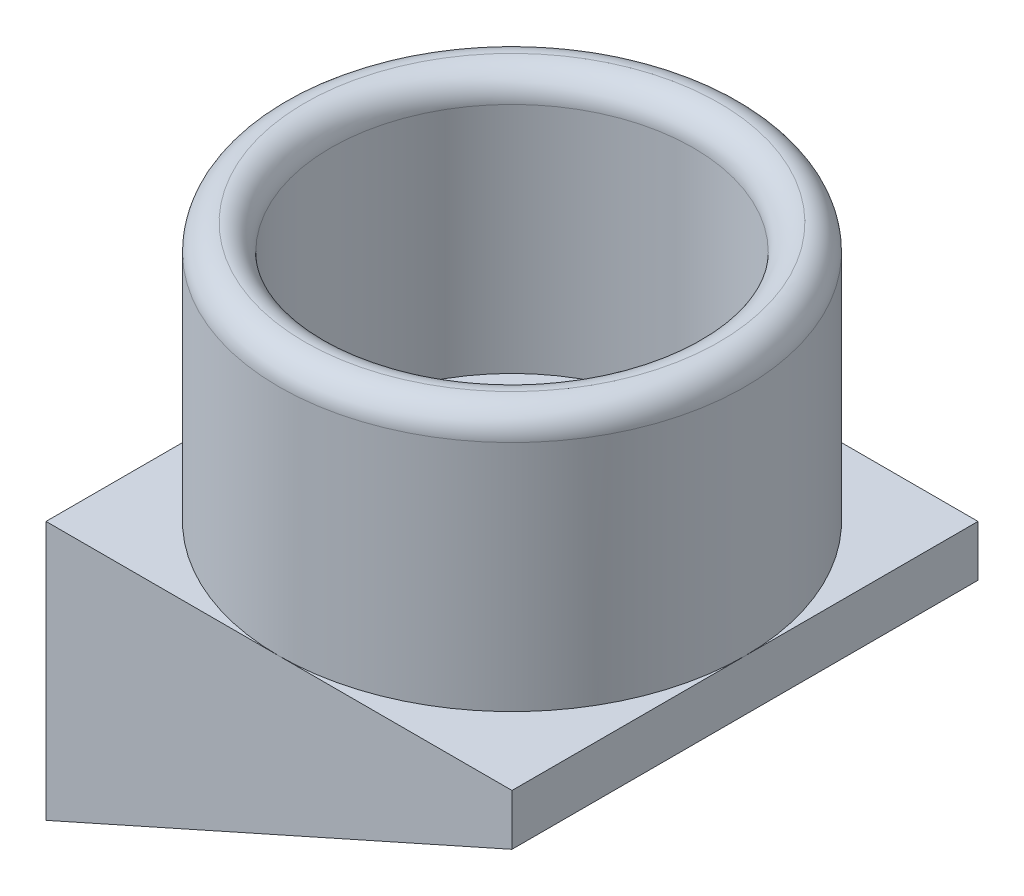
ISO-10303-21;
HEADER;
FILE_DESCRIPTION(('STEP AP214'),'2;1');
FILE_NAME('part.step','',(''),(''),'','','');
FILE_SCHEMA(('AUTOMOTIVE_DESIGN { 1 0 10303 214 1 1 1 1 }'));
ENDSEC;
DATA;
#1=APPLICATION_CONTEXT('core data for automotive mechanical design processes');
#2=APPLICATION_PROTOCOL_DEFINITION('international standard','automotive_design',2000,#1);
#3=PRODUCT_CONTEXT('',#1,'mechanical');
#4=PRODUCT('Part','Part','',(#3));
#5=PRODUCT_RELATED_PRODUCT_CATEGORY('part','',(#4));
#6=PRODUCT_DEFINITION_FORMATION('','',#4);
#7=PRODUCT_DEFINITION_CONTEXT('part definition',#1,'design');
#8=PRODUCT_DEFINITION('design','',#6,#7);
#9=PRODUCT_DEFINITION_SHAPE('','',#8);
#10=(LENGTH_UNIT() NAMED_UNIT(*) SI_UNIT(.MILLI.,.METRE.));
#11=(NAMED_UNIT(*) PLANE_ANGLE_UNIT() SI_UNIT($,.RADIAN.));
#12=(NAMED_UNIT(*) SI_UNIT($,.STERADIAN.) SOLID_ANGLE_UNIT());
#13=UNCERTAINTY_MEASURE_WITH_UNIT(LENGTH_MEASURE(1.E-05),#10,'distance_accuracy_value','');
#14=(GEOMETRIC_REPRESENTATION_CONTEXT(3) GLOBAL_UNCERTAINTY_ASSIGNED_CONTEXT((#13)) GLOBAL_UNIT_ASSIGNED_CONTEXT((#10,
#11,#12)) REPRESENTATION_CONTEXT('',''));
#15=CARTESIAN_POINT('',(0.,0.,0.));
#16=DIRECTION('',(0.,0.,1.));
#17=DIRECTION('',(1.,0.,0.));
#18=AXIS2_PLACEMENT_3D('',#15,#16,#17);
#19=CARTESIAN_POINT('',(0.,10.,0.));
#20=DIRECTION('',(0.,-1.,0.));
#21=DIRECTION('',(0.,0.,-1.));
#22=AXIS2_PLACEMENT_3D('',#19,#20,#21);
#23=CYLINDRICAL_SURFACE('',#22,9.);
#24=CARTESIAN_POINT('',(0.,9.,0.));
#25=DIRECTION('',(0.,1.,0.));
#26=DIRECTION('',(0.,0.,1.));
#27=AXIS2_PLACEMENT_3D('',#24,#25,#26);
#28=CIRCLE('',#27,9.);
#29=CARTESIAN_POINT('',(0.,9.,9.));
#30=VERTEX_POINT('',#29);
#31=EDGE_CURVE('E11',#30,#30,#28,.F.);
#32=ORIENTED_EDGE('',*,*,#31,.T.);
#33=EDGE_LOOP('',(#32));
#34=FACE_BOUND('',#33,.T.);
#35=CARTESIAN_POINT('',(0.,0.,0.));
#36=DIRECTION('',(0.,1.,0.));
#37=DIRECTION('',(0.,0.,1.));
#38=AXIS2_PLACEMENT_3D('',#35,#36,#37);
#39=CIRCLE('',#38,9.);
#40=CARTESIAN_POINT('',(0.,0.,9.));
#41=VERTEX_POINT('',#40);
#42=CARTESIAN_POINT('',(9.,0.,0.));
#43=VERTEX_POINT('',#42);
#44=EDGE_CURVE('E145',#41,#43,#39,.T.);
#45=ORIENTED_EDGE('',*,*,#44,.T.);
#46=CARTESIAN_POINT('',(0.,0.,-9.));
#47=VERTEX_POINT('',#46);
#48=EDGE_CURVE('E149',#43,#47,#39,.T.);
#49=ORIENTED_EDGE('',*,*,#48,.T.);
#50=CARTESIAN_POINT('',(-9.,0.,0.));
#51=VERTEX_POINT('',#50);
#52=EDGE_CURVE('E288',#47,#51,#39,.T.);
#53=ORIENTED_EDGE('',*,*,#52,.T.);
#54=EDGE_CURVE('E69',#51,#41,#39,.T.);
#55=ORIENTED_EDGE('',*,*,#54,.T.);
#56=EDGE_LOOP('',(#45,#49,#53,#55));
#57=FACE_BOUND('',#56,.T.);
#58=ADVANCED_FACE('F45',(#34,#57),#23,.T.);
#59=CARTESIAN_POINT('',(0.,10.,0.));
#60=DIRECTION('',(0.,-1.,0.));
#61=DIRECTION('',(0.,0.,-1.));
#62=AXIS2_PLACEMENT_3D('',#59,#60,#61);
#63=CYLINDRICAL_SURFACE('',#62,7.);
#64=CARTESIAN_POINT('',(0.,9.,0.));
#65=DIRECTION('',(0.,1.,0.));
#66=DIRECTION('',(0.,0.,1.));
#67=AXIS2_PLACEMENT_3D('',#64,#65,#66);
#68=CIRCLE('',#67,7.);
#69=CARTESIAN_POINT('',(0.,9.,7.));
#70=VERTEX_POINT('',#69);
#71=EDGE_CURVE('E55',#70,#70,#68,.T.);
#72=ORIENTED_EDGE('',*,*,#71,.T.);
#73=EDGE_LOOP('',(#72));
#74=FACE_BOUND('',#73,.T.);
#75=CARTESIAN_POINT('',(0.,0.,0.));
#76=DIRECTION('',(0.,1.,0.));
#77=DIRECTION('',(0.,0.,1.));
#78=AXIS2_PLACEMENT_3D('',#75,#76,#77);
#79=CIRCLE('',#78,7.);
#80=CARTESIAN_POINT('',(0.,0.,7.));
#81=VERTEX_POINT('',#80);
#82=EDGE_CURVE('E141',#81,#81,#79,.T.);
#83=ORIENTED_EDGE('',*,*,#82,.F.);
#84=EDGE_LOOP('',(#83));
#85=FACE_BOUND('',#84,.T.);
#86=ADVANCED_FACE('F154',(#74,#85),#63,.F.);
#87=CARTESIAN_POINT('',(0.,9.,0.));
#88=DIRECTION('',(0.,1.,0.));
#89=DIRECTION('',(0.,0.,1.));
#90=AXIS2_PLACEMENT_3D('',#87,#88,#89);
#91=TOROIDAL_SURFACE('',#90,8.,1.);
#92=ORIENTED_EDGE('',*,*,#31,.F.);
#93=EDGE_LOOP('',(#92));
#94=FACE_BOUND('',#93,.T.);
#95=CARTESIAN_POINT('',(0.,10.,0.));
#96=DIRECTION('',(0.,1.,0.));
#97=DIRECTION('',(0.,0.,1.));
#98=AXIS2_PLACEMENT_3D('',#95,#96,#97);
#99=CIRCLE('',#98,8.);
#100=CARTESIAN_POINT('',(0.,10.,8.));
#101=VERTEX_POINT('',#100);
#102=EDGE_CURVE('E49',#101,#101,#99,.T.);
#103=ORIENTED_EDGE('',*,*,#102,.F.);
#104=EDGE_LOOP('',(#103));
#105=FACE_BOUND('',#104,.T.);
#106=ADVANCED_FACE('F47',(#94,#105),#91,.T.);
#107=CARTESIAN_POINT('',(0.,9.,0.));
#108=DIRECTION('',(0.,1.,0.));
#109=DIRECTION('',(0.,0.,1.));
#110=AXIS2_PLACEMENT_3D('',#107,#108,#109);
#111=TOROIDAL_SURFACE('',#110,8.,1.);
#112=ORIENTED_EDGE('',*,*,#102,.T.);
#113=EDGE_LOOP('',(#112));
#114=FACE_BOUND('',#113,.T.);
#115=ORIENTED_EDGE('',*,*,#71,.F.);
#116=EDGE_LOOP('',(#115));
#117=FACE_BOUND('',#116,.T.);
#118=ADVANCED_FACE('F157',(#114,#117),#111,.T.);
#119=CARTESIAN_POINT('',(0.,0.,0.));
#120=DIRECTION('',(0.,1.,0.));
#121=DIRECTION('',(0.,0.,1.));
#122=AXIS2_PLACEMENT_3D('',#119,#120,#121);
#123=PLANE('',#122);
#124=ORIENTED_EDGE('',*,*,#82,.T.);
#125=EDGE_LOOP('',(#124));
#126=FACE_BOUND('',#125,.T.);
#127=ADVANCED_FACE('F159',(#126),#123,.T.);
#128=ORIENTED_EDGE('',*,*,#44,.F.);
#129=DIRECTION('',(-1.,0.,0.));
#130=VECTOR('',#129,1.);
#131=CARTESIAN_POINT('',(-9.,0.,9.));
#132=LINE('',#131,#130);
#133=CARTESIAN_POINT('',(9.,0.,9.));
#134=VERTEX_POINT('',#133);
#135=EDGE_CURVE('E62',#134,#41,#132,.T.);
#136=ORIENTED_EDGE('',*,*,#135,.F.);
#137=DIRECTION('',(0.,0.,1.));
#138=VECTOR('',#137,1.);
#139=CARTESIAN_POINT('',(9.,0.,-9.));
#140=LINE('',#139,#138);
#141=EDGE_CURVE('E284',#43,#134,#140,.T.);
#142=ORIENTED_EDGE('',*,*,#141,.F.);
#143=EDGE_LOOP('',(#128,#136,#142));
#144=FACE_BOUND('',#143,.T.);
#145=ADVANCED_FACE('F166',(#144),#123,.T.);
#146=ORIENTED_EDGE('',*,*,#48,.F.);
#147=CARTESIAN_POINT('',(9.,0.,-9.));
#148=VERTEX_POINT('',#147);
#149=EDGE_CURVE('E294',#148,#43,#140,.T.);
#150=ORIENTED_EDGE('',*,*,#149,.F.);
#151=DIRECTION('',(1.,0.,0.));
#152=VECTOR('',#151,1.);
#153=CARTESIAN_POINT('',(-9.,0.,-9.));
#154=LINE('',#153,#152);
#155=EDGE_CURVE('E295',#47,#148,#154,.T.);
#156=ORIENTED_EDGE('',*,*,#155,.F.);
#157=EDGE_LOOP('',(#146,#150,#156));
#158=FACE_BOUND('',#157,.T.);
#159=ADVANCED_FACE('F228',(#158),#123,.T.);
#160=ORIENTED_EDGE('',*,*,#52,.F.);
#161=CARTESIAN_POINT('',(-9.,0.,-9.));
#162=VERTEX_POINT('',#161);
#163=EDGE_CURVE('E113',#162,#47,#154,.T.);
#164=ORIENTED_EDGE('',*,*,#163,.F.);
#165=DIRECTION('',(0.,0.,-1.));
#166=VECTOR('',#165,1.);
#167=CARTESIAN_POINT('',(-9.,0.,-9.));
#168=LINE('',#167,#166);
#169=EDGE_CURVE('E128',#51,#162,#168,.T.);
#170=ORIENTED_EDGE('',*,*,#169,.F.);
#171=EDGE_LOOP('',(#160,#164,#170));
#172=FACE_BOUND('',#171,.T.);
#173=ADVANCED_FACE('F221',(#172),#123,.T.);
#174=ORIENTED_EDGE('',*,*,#54,.F.);
#175=CARTESIAN_POINT('',(-9.,0.,9.));
#176=VERTEX_POINT('',#175);
#177=EDGE_CURVE('E297',#176,#51,#168,.T.);
#178=ORIENTED_EDGE('',*,*,#177,.F.);
#179=EDGE_CURVE('E304',#41,#176,#132,.T.);
#180=ORIENTED_EDGE('',*,*,#179,.F.);
#181=EDGE_LOOP('',(#174,#178,#180));
#182=FACE_BOUND('',#181,.T.);
#183=ADVANCED_FACE('F169',(#182),#123,.T.);
#184=CARTESIAN_POINT('',(9.,-10.,-9.));
#185=DIRECTION('',(-1.,0.,0.));
#186=DIRECTION('',(0.,0.,1.));
#187=AXIS2_PLACEMENT_3D('',#184,#185,#186);
#188=PLANE('',#187);
#189=DIRECTION('',(0.,1.,0.));
#190=VECTOR('',#189,1.);
#191=CARTESIAN_POINT('',(9.,-10.,9.));
#192=LINE('',#191,#190);
#193=CARTESIAN_POINT('',(9.,-1.9697719153613,9.));
#194=VERTEX_POINT('',#193);
#195=EDGE_CURVE('E134',#194,#134,#192,.T.);
#196=ORIENTED_EDGE('',*,*,#195,.F.);
#197=DIRECTION('',(0.,0.,1.));
#198=VECTOR('',#197,1.);
#199=CARTESIAN_POINT('',(9.,-1.9697719153613,-9.));
#200=LINE('',#199,#198);
#201=CARTESIAN_POINT('',(9.,-1.9697719153613,-9.));
#202=VERTEX_POINT('',#201);
#203=EDGE_CURVE('E124',#202,#194,#200,.T.);
#204=ORIENTED_EDGE('',*,*,#203,.F.);
#205=DIRECTION('',(0.,1.,0.));
#206=VECTOR('',#205,1.);
#207=CARTESIAN_POINT('',(9.,-10.,-9.));
#208=LINE('',#207,#206);
#209=EDGE_CURVE('E112',#202,#148,#208,.T.);
#210=ORIENTED_EDGE('',*,*,#209,.T.);
#211=ORIENTED_EDGE('',*,*,#149,.T.);
#212=ORIENTED_EDGE('',*,*,#141,.T.);
#213=EDGE_LOOP('',(#196,#204,#210,#211,#212));
#214=FACE_BOUND('',#213,.T.);
#215=ADVANCED_FACE('F180',(#214),#188,.F.);
#216=CARTESIAN_POINT('',(-9.,-10.,9.));
#217=DIRECTION('',(0.,0.,-1.));
#218=DIRECTION('',(-1.,0.,0.));
#219=AXIS2_PLACEMENT_3D('',#216,#217,#218);
#220=PLANE('',#219);
#221=DIRECTION('',(0.,1.,0.));
#222=VECTOR('',#221,1.);
#223=CARTESIAN_POINT('',(-9.,-10.,9.));
#224=LINE('',#223,#222);
#225=CARTESIAN_POINT('',(-9.,-10.,9.));
#226=VERTEX_POINT('',#225);
#227=EDGE_CURVE('E130',#226,#176,#224,.T.);
#228=ORIENTED_EDGE('',*,*,#227,.F.);
#229=DIRECTION('',(-0.913241464819191,-0.407418736602648,0.));
#230=VECTOR('',#229,1.);
#231=CARTESIAN_POINT('',(9.,-1.9697719153613,9.));
#232=LINE('',#231,#230);
#233=EDGE_CURVE('E106',#194,#226,#232,.T.);
#234=ORIENTED_EDGE('',*,*,#233,.F.);
#235=ORIENTED_EDGE('',*,*,#195,.T.);
#236=ORIENTED_EDGE('',*,*,#135,.T.);
#237=ORIENTED_EDGE('',*,*,#179,.T.);
#238=EDGE_LOOP('',(#228,#234,#235,#236,#237));
#239=FACE_BOUND('',#238,.T.);
#240=ADVANCED_FACE('F183',(#239),#220,.F.);
#241=CARTESIAN_POINT('',(-9.,-10.,-9.));
#242=DIRECTION('',(1.,0.,0.));
#243=DIRECTION('',(0.,0.,-1.));
#244=AXIS2_PLACEMENT_3D('',#241,#242,#243);
#245=PLANE('',#244);
#246=ORIENTED_EDGE('',*,*,#177,.T.);
#247=ORIENTED_EDGE('',*,*,#169,.T.);
#248=DIRECTION('',(0.,1.,0.));
#249=VECTOR('',#248,1.);
#250=CARTESIAN_POINT('',(-9.,-10.,-9.));
#251=LINE('',#250,#249);
#252=CARTESIAN_POINT('',(-9.,-10.,-9.));
#253=VERTEX_POINT('',#252);
#254=EDGE_CURVE('E120',#253,#162,#251,.T.);
#255=ORIENTED_EDGE('',*,*,#254,.F.);
#256=DIRECTION('',(0.,0.,-1.));
#257=VECTOR('',#256,1.);
#258=CARTESIAN_POINT('',(-9.,-10.,-9.));
#259=LINE('',#258,#257);
#260=EDGE_CURVE('E100',#226,#253,#259,.T.);
#261=ORIENTED_EDGE('',*,*,#260,.F.);
#262=ORIENTED_EDGE('',*,*,#227,.T.);
#263=EDGE_LOOP('',(#246,#247,#255,#261,#262));
#264=FACE_BOUND('',#263,.T.);
#265=ADVANCED_FACE('F127',(#264),#245,.F.);
#266=CARTESIAN_POINT('',(-9.,-10.,-9.));
#267=DIRECTION('',(0.,0.,1.));
#268=DIRECTION('',(1.,0.,0.));
#269=AXIS2_PLACEMENT_3D('',#266,#267,#268);
#270=PLANE('',#269);
#271=ORIENTED_EDGE('',*,*,#209,.F.);
#272=DIRECTION('',(-0.913241464819191,-0.407418736602648,0.));
#273=VECTOR('',#272,1.);
#274=CARTESIAN_POINT('',(9.,-1.9697719153613,-9.));
#275=LINE('',#274,#273);
#276=EDGE_CURVE('E103',#202,#253,#275,.T.);
#277=ORIENTED_EDGE('',*,*,#276,.T.);
#278=ORIENTED_EDGE('',*,*,#254,.T.);
#279=ORIENTED_EDGE('',*,*,#163,.T.);
#280=ORIENTED_EDGE('',*,*,#155,.T.);
#281=EDGE_LOOP('',(#271,#277,#278,#279,#280));
#282=FACE_BOUND('',#281,.T.);
#283=ADVANCED_FACE('F118',(#282),#270,.F.);
#284=CARTESIAN_POINT('',(9.,-1.9697719153613,-9.));
#285=DIRECTION('',(-0.407418736602648,0.913241464819192,0.));
#286=DIRECTION('',(-0.913241464819192,-0.407418736602648,0.));
#287=AXIS2_PLACEMENT_3D('',#284,#285,#286);
#288=PLANE('',#287);
#289=ORIENTED_EDGE('',*,*,#233,.T.);
#290=ORIENTED_EDGE('',*,*,#260,.T.);
#291=ORIENTED_EDGE('',*,*,#276,.F.);
#292=ORIENTED_EDGE('',*,*,#203,.T.);
#293=EDGE_LOOP('',(#289,#290,#291,#292));
#294=FACE_BOUND('',#293,.T.);
#295=ADVANCED_FACE('F102',(#294),#288,.F.);
#296=CLOSED_SHELL('',(#58,#86,#106,#118,#127,#145,#159,#173,#183,#215,#240,#265,#283,#295));
#297=MANIFOLD_SOLID_BREP('B2',#296);
#298=ADVANCED_BREP_SHAPE_REPRESENTATION('',(#18,#297),#14);
#299=SHAPE_DEFINITION_REPRESENTATION(#9,#298);
ENDSEC;
END-ISO-10303-21;
